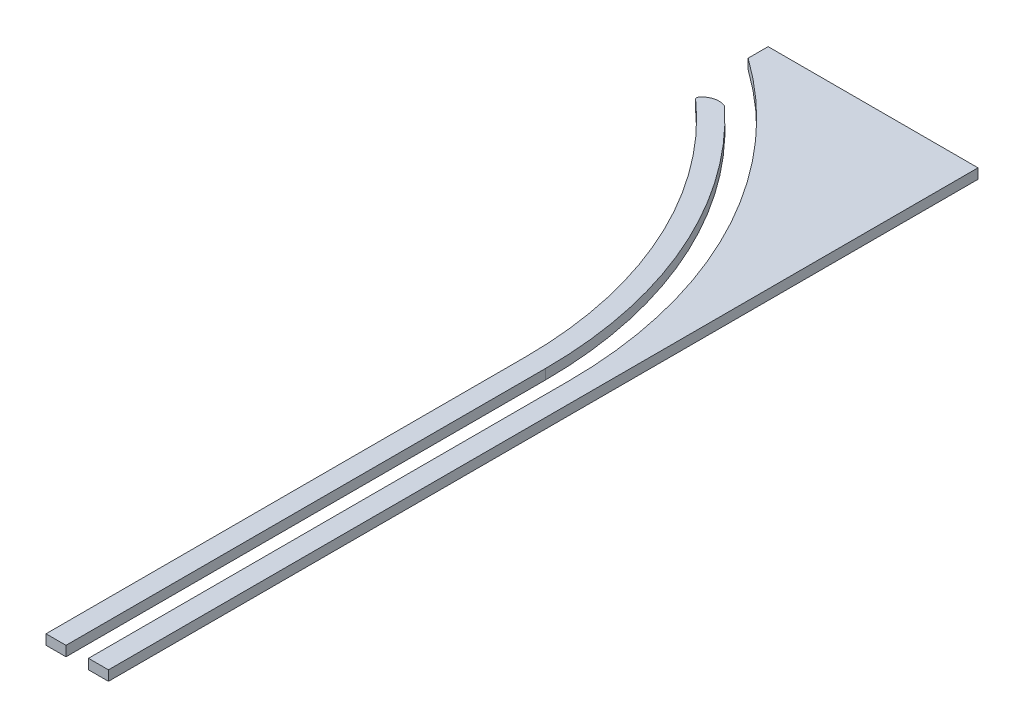
ISO-10303-21;
HEADER;
FILE_DESCRIPTION(('STEP AP214'),'2;1');
FILE_NAME('part.step','',(''),(''),'','','');
FILE_SCHEMA(('AUTOMOTIVE_DESIGN { 1 0 10303 214 1 1 1 1 }'));
ENDSEC;
DATA;
#1=APPLICATION_CONTEXT('core data for automotive mechanical design processes');
#2=APPLICATION_PROTOCOL_DEFINITION('international standard','automotive_design',2000,#1);
#3=PRODUCT_CONTEXT('',#1,'mechanical');
#4=PRODUCT('Part','Part','',(#3));
#5=PRODUCT_RELATED_PRODUCT_CATEGORY('part','',(#4));
#6=PRODUCT_DEFINITION_FORMATION('','',#4);
#7=PRODUCT_DEFINITION_CONTEXT('part definition',#1,'design');
#8=PRODUCT_DEFINITION('design','',#6,#7);
#9=PRODUCT_DEFINITION_SHAPE('','',#8);
#10=(LENGTH_UNIT() NAMED_UNIT(*) SI_UNIT(.MILLI.,.METRE.));
#11=(NAMED_UNIT(*) PLANE_ANGLE_UNIT() SI_UNIT($,.RADIAN.));
#12=(NAMED_UNIT(*) SI_UNIT($,.STERADIAN.) SOLID_ANGLE_UNIT());
#13=UNCERTAINTY_MEASURE_WITH_UNIT(LENGTH_MEASURE(1.E-05),#10,'distance_accuracy_value','');
#14=(GEOMETRIC_REPRESENTATION_CONTEXT(3) GLOBAL_UNCERTAINTY_ASSIGNED_CONTEXT((#13)) GLOBAL_UNIT_ASSIGNED_CONTEXT((#10,
#11,#12)) REPRESENTATION_CONTEXT('',''));
#15=CARTESIAN_POINT('',(0.,0.,0.));
#16=DIRECTION('',(0.,0.,1.));
#17=DIRECTION('',(1.,0.,0.));
#18=AXIS2_PLACEMENT_3D('',#15,#16,#17);
#19=CARTESIAN_POINT('',(255.5875,12.7,0.));
#20=DIRECTION('',(-1.,0.,0.));
#21=DIRECTION('',(0.,0.,1.));
#22=AXIS2_PLACEMENT_3D('',#19,#20,#21);
#23=PLANE('',#22);
#24=DIRECTION('',(0.,0.,-1.));
#25=VECTOR('',#24,1.);
#26=CARTESIAN_POINT('',(255.5875,0.,0.));
#27=LINE('',#26,#25);
#28=CARTESIAN_POINT('',(255.5875,0.,0.));
#29=VERTEX_POINT('',#28);
#30=CARTESIAN_POINT('',(255.5875,0.,-1104.9));
#31=VERTEX_POINT('',#30);
#32=EDGE_CURVE('E138',#29,#31,#27,.T.);
#33=ORIENTED_EDGE('',*,*,#32,.T.);
#34=DIRECTION('',(0.,-1.,0.));
#35=VECTOR('',#34,1.);
#36=CARTESIAN_POINT('',(255.5875,12.7,-1104.9));
#37=LINE('',#36,#35);
#38=CARTESIAN_POINT('',(255.5875,12.7,-1104.9));
#39=VERTEX_POINT('',#38);
#40=EDGE_CURVE('E12',#39,#31,#37,.T.);
#41=ORIENTED_EDGE('',*,*,#40,.F.);
#42=DIRECTION('',(0.,0.,-1.));
#43=VECTOR('',#42,1.);
#44=CARTESIAN_POINT('',(255.5875,12.7,0.));
#45=LINE('',#44,#43);
#46=CARTESIAN_POINT('',(255.5875,12.7,0.));
#47=VERTEX_POINT('',#46);
#48=EDGE_CURVE('E154',#47,#39,#45,.T.);
#49=ORIENTED_EDGE('',*,*,#48,.F.);
#50=DIRECTION('',(0.,-1.,0.));
#51=VECTOR('',#50,1.);
#52=CARTESIAN_POINT('',(255.5875,12.7,0.));
#53=LINE('',#52,#51);
#54=EDGE_CURVE('E134',#47,#29,#53,.T.);
#55=ORIENTED_EDGE('',*,*,#54,.T.);
#56=EDGE_LOOP('',(#33,#41,#49,#55));
#57=FACE_BOUND('',#56,.T.);
#58=ADVANCED_FACE('F49',(#57),#23,.F.);
#59=CARTESIAN_POINT('',(-11.1125,12.7,-1104.9));
#60=DIRECTION('',(0.,0.,1.));
#61=DIRECTION('',(1.,0.,0.));
#62=AXIS2_PLACEMENT_3D('',#59,#60,#61);
#63=PLANE('',#62);
#64=DIRECTION('',(-1.,0.,0.));
#65=VECTOR('',#64,1.);
#66=CARTESIAN_POINT('',(-11.1125,0.,-1104.9));
#67=LINE('',#66,#65);
#68=CARTESIAN_POINT('',(-11.1125,0.,-1104.9));
#69=VERTEX_POINT('',#68);
#70=EDGE_CURVE('E142',#31,#69,#67,.T.);
#71=ORIENTED_EDGE('',*,*,#70,.T.);
#72=DIRECTION('',(0.,-1.,0.));
#73=VECTOR('',#72,1.);
#74=CARTESIAN_POINT('',(-11.1125,12.7,-1104.9));
#75=LINE('',#74,#73);
#76=CARTESIAN_POINT('',(-11.1125,12.7,-1104.9));
#77=VERTEX_POINT('',#76);
#78=EDGE_CURVE('E58',#77,#69,#75,.T.);
#79=ORIENTED_EDGE('',*,*,#78,.F.);
#80=DIRECTION('',(-1.,0.,0.));
#81=VECTOR('',#80,1.);
#82=CARTESIAN_POINT('',(-11.1125,12.7,-1104.9));
#83=LINE('',#82,#81);
#84=EDGE_CURVE('E103',#39,#77,#83,.T.);
#85=ORIENTED_EDGE('',*,*,#84,.F.);
#86=ORIENTED_EDGE('',*,*,#40,.T.);
#87=EDGE_LOOP('',(#71,#79,#85,#86));
#88=FACE_BOUND('',#87,.T.);
#89=ADVANCED_FACE('F182',(#88),#63,.F.);
#90=CARTESIAN_POINT('',(-11.1124999999999,12.7,-1079.5));
#91=DIRECTION('',(1.,0.,0.));
#92=DIRECTION('',(0.,0.,-1.));
#93=AXIS2_PLACEMENT_3D('',#90,#91,#92);
#94=PLANE('',#93);
#95=DIRECTION('',(0.,0.,1.));
#96=VECTOR('',#95,1.);
#97=CARTESIAN_POINT('',(-11.1124999999999,0.,-1079.5));
#98=LINE('',#97,#96);
#99=CARTESIAN_POINT('',(-11.1124999999999,0.,-1079.5));
#100=VERTEX_POINT('',#99);
#101=EDGE_CURVE('E145',#69,#100,#98,.T.);
#102=ORIENTED_EDGE('',*,*,#101,.T.);
#103=DIRECTION('',(0.,-1.,0.));
#104=VECTOR('',#103,1.);
#105=CARTESIAN_POINT('',(-11.1124999999999,12.7,-1079.5));
#106=LINE('',#105,#104);
#107=CARTESIAN_POINT('',(-11.1124999999999,12.7,-1079.5));
#108=VERTEX_POINT('',#107);
#109=EDGE_CURVE('E127',#108,#100,#106,.T.);
#110=ORIENTED_EDGE('',*,*,#109,.F.);
#111=DIRECTION('',(0.,0.,1.));
#112=VECTOR('',#111,1.);
#113=CARTESIAN_POINT('',(-11.1124999999999,12.7,-1079.5));
#114=LINE('',#113,#112);
#115=EDGE_CURVE('E116',#77,#108,#114,.T.);
#116=ORIENTED_EDGE('',*,*,#115,.F.);
#117=ORIENTED_EDGE('',*,*,#78,.T.);
#118=EDGE_LOOP('',(#102,#110,#116,#117));
#119=FACE_BOUND('',#118,.T.);
#120=ADVANCED_FACE('F164',(#119),#94,.F.);
#121=CARTESIAN_POINT('',(-347.996710526316,12.7,-609.6));
#122=DIRECTION('',(0.,-1.,0.));
#123=DIRECTION('',(0.,0.,-1.));
#124=AXIS2_PLACEMENT_3D('',#121,#122,#123);
#125=CYLINDRICAL_SURFACE('',#124,578.184210526316);
#126=CARTESIAN_POINT('',(-347.996710526316,0.,-609.6));
#127=DIRECTION('',(0.,-1.,0.));
#128=DIRECTION('',(0.,0.,-1.));
#129=AXIS2_PLACEMENT_3D('',#126,#127,#128);
#130=CIRCLE('',#129,578.184210526316);
#131=CARTESIAN_POINT('',(230.1875,0.,-609.6));
#132=VERTEX_POINT('',#131);
#133=EDGE_CURVE('E125',#100,#132,#130,.T.);
#134=ORIENTED_EDGE('',*,*,#133,.T.);
#135=DIRECTION('',(0.,-1.,0.));
#136=VECTOR('',#135,1.);
#137=CARTESIAN_POINT('',(230.1875,12.7,-609.6));
#138=LINE('',#137,#136);
#139=CARTESIAN_POINT('',(230.1875,12.7,-609.6));
#140=VERTEX_POINT('',#139);
#141=EDGE_CURVE('E122',#140,#132,#138,.T.);
#142=ORIENTED_EDGE('',*,*,#141,.F.);
#143=CARTESIAN_POINT('',(-347.996710526316,12.7,-609.6));
#144=DIRECTION('',(0.,-1.,0.));
#145=DIRECTION('',(0.,0.,-1.));
#146=AXIS2_PLACEMENT_3D('',#143,#144,#145);
#147=CIRCLE('',#146,578.184210526316);
#148=EDGE_CURVE('E110',#108,#140,#147,.T.);
#149=ORIENTED_EDGE('',*,*,#148,.F.);
#150=ORIENTED_EDGE('',*,*,#109,.T.);
#151=EDGE_LOOP('',(#134,#142,#149,#150));
#152=FACE_BOUND('',#151,.T.);
#153=ADVANCED_FACE('F123',(#152),#125,.F.);
#154=CARTESIAN_POINT('',(230.1875,12.7,0.));
#155=DIRECTION('',(1.,0.,0.));
#156=DIRECTION('',(0.,0.,-1.));
#157=AXIS2_PLACEMENT_3D('',#154,#155,#156);
#158=PLANE('',#157);
#159=DIRECTION('',(0.,0.,1.));
#160=VECTOR('',#159,1.);
#161=CARTESIAN_POINT('',(230.1875,0.,0.));
#162=LINE('',#161,#160);
#163=CARTESIAN_POINT('',(230.1875,0.,0.));
#164=VERTEX_POINT('',#163);
#165=EDGE_CURVE('E89',#132,#164,#162,.T.);
#166=ORIENTED_EDGE('',*,*,#165,.T.);
#167=DIRECTION('',(0.,-1.,0.));
#168=VECTOR('',#167,1.);
#169=CARTESIAN_POINT('',(230.1875,12.7,0.));
#170=LINE('',#169,#168);
#171=CARTESIAN_POINT('',(230.1875,12.7,0.));
#172=VERTEX_POINT('',#171);
#173=EDGE_CURVE('E128',#172,#164,#170,.T.);
#174=ORIENTED_EDGE('',*,*,#173,.F.);
#175=DIRECTION('',(0.,0.,1.));
#176=VECTOR('',#175,1.);
#177=CARTESIAN_POINT('',(230.1875,12.7,0.));
#178=LINE('',#177,#176);
#179=EDGE_CURVE('E114',#140,#172,#178,.T.);
#180=ORIENTED_EDGE('',*,*,#179,.F.);
#181=ORIENTED_EDGE('',*,*,#141,.T.);
#182=EDGE_LOOP('',(#166,#174,#180,#181));
#183=FACE_BOUND('',#182,.T.);
#184=ADVANCED_FACE('F130',(#183),#158,.F.);
#185=CARTESIAN_POINT('',(230.1875,12.7,0.));
#186=DIRECTION('',(0.,0.,-1.));
#187=DIRECTION('',(-1.,0.,0.));
#188=AXIS2_PLACEMENT_3D('',#185,#186,#187);
#189=PLANE('',#188);
#190=DIRECTION('',(1.,0.,0.));
#191=VECTOR('',#190,1.);
#192=CARTESIAN_POINT('',(230.1875,0.,0.));
#193=LINE('',#192,#191);
#194=EDGE_CURVE('E95',#164,#29,#193,.T.);
#195=ORIENTED_EDGE('',*,*,#194,.T.);
#196=ORIENTED_EDGE('',*,*,#54,.F.);
#197=DIRECTION('',(1.,0.,0.));
#198=VECTOR('',#197,1.);
#199=CARTESIAN_POINT('',(230.1875,12.7,0.));
#200=LINE('',#199,#198);
#201=EDGE_CURVE('E66',#172,#47,#200,.T.);
#202=ORIENTED_EDGE('',*,*,#201,.F.);
#203=ORIENTED_EDGE('',*,*,#173,.T.);
#204=EDGE_LOOP('',(#195,#196,#202,#203));
#205=FACE_BOUND('',#204,.T.);
#206=ADVANCED_FACE('F171',(#205),#189,.F.);
#207=CARTESIAN_POINT('',(-347.996710526316,12.7,-609.6));
#208=DIRECTION('',(0.,-1.,0.));
#209=DIRECTION('',(0.,0.,-1.));
#210=AXIS2_PLACEMENT_3D('',#207,#208,#209);
#211=PLANE('',#210);
#212=ORIENTED_EDGE('',*,*,#48,.T.);
#213=ORIENTED_EDGE('',*,*,#84,.T.);
#214=ORIENTED_EDGE('',*,*,#115,.T.);
#215=ORIENTED_EDGE('',*,*,#148,.T.);
#216=ORIENTED_EDGE('',*,*,#179,.T.);
#217=ORIENTED_EDGE('',*,*,#201,.T.);
#218=EDGE_LOOP('',(#212,#213,#214,#215,#216,#217));
#219=FACE_BOUND('',#218,.T.);
#220=ADVANCED_FACE('F112',(#219),#211,.F.);
#221=CARTESIAN_POINT('',(-347.996710526316,0.,-609.6));
#222=DIRECTION('',(0.,-1.,0.));
#223=DIRECTION('',(0.,0.,-1.));
#224=AXIS2_PLACEMENT_3D('',#221,#222,#223);
#225=PLANE('',#224);
#226=ORIENTED_EDGE('',*,*,#32,.F.);
#227=ORIENTED_EDGE('',*,*,#194,.F.);
#228=ORIENTED_EDGE('',*,*,#165,.F.);
#229=ORIENTED_EDGE('',*,*,#133,.F.);
#230=ORIENTED_EDGE('',*,*,#101,.F.);
#231=ORIENTED_EDGE('',*,*,#70,.F.);
#232=EDGE_LOOP('',(#226,#227,#228,#229,#230,#231));
#233=FACE_BOUND('',#232,.T.);
#234=ADVANCED_FACE('F167',(#233),#225,.T.);
#235=CLOSED_SHELL('',(#58,#89,#120,#153,#184,#206,#220,#234));
#236=MANIFOLD_SOLID_BREP('B2',#235);
#237=CARTESIAN_POINT('',(17.5460842992737,12.7,-992.451036276401));
#238=DIRECTION('',(0.,-1.,0.));
#239=DIRECTION('',(0.,0.,-1.));
#240=AXIS2_PLACEMENT_3D('',#237,#238,#239);
#241=CYLINDRICAL_SURFACE('',#240,21.3347076919833);
#242=CARTESIAN_POINT('',(17.5460842992737,0.,-992.451036276401));
#243=DIRECTION('',(0.,1.,0.));
#244=DIRECTION('',(0.,0.,1.));
#245=AXIS2_PLACEMENT_3D('',#242,#243,#244);
#246=CIRCLE('',#245,21.3347076919833);
#247=CARTESIAN_POINT('',(26.6199629643412,0.,-1011.75995852167));
#248=VERTEX_POINT('',#247);
#249=CARTESIAN_POINT('',(0.0177272490470685,0.,-1004.61353813343));
#250=VERTEX_POINT('',#249);
#251=EDGE_CURVE('E333',#248,#250,#246,.T.);
#252=ORIENTED_EDGE('',*,*,#251,.T.);
#253=DIRECTION('',(0.,-1.,0.));
#254=VECTOR('',#253,1.);
#255=CARTESIAN_POINT('',(0.0177272490470685,12.7,-1004.61353813343));
#256=LINE('',#255,#254);
#257=CARTESIAN_POINT('',(0.0177272490470685,12.7,-1004.61353813343));
#258=VERTEX_POINT('',#257);
#259=EDGE_CURVE('E47',#258,#250,#256,.T.);
#260=ORIENTED_EDGE('',*,*,#259,.F.);
#261=CARTESIAN_POINT('',(17.5460842992737,12.7,-992.451036276401));
#262=DIRECTION('',(0.,1.,0.));
#263=DIRECTION('',(0.,0.,1.));
#264=AXIS2_PLACEMENT_3D('',#261,#262,#263);
#265=CIRCLE('',#264,21.3347076919833);
#266=CARTESIAN_POINT('',(26.6199629643412,12.7,-1011.75995852167));
#267=VERTEX_POINT('',#266);
#268=EDGE_CURVE('E345',#267,#258,#265,.T.);
#269=ORIENTED_EDGE('',*,*,#268,.F.);
#270=DIRECTION('',(0.,-1.,0.));
#271=VECTOR('',#270,1.);
#272=CARTESIAN_POINT('',(26.6199629643412,12.7,-1011.75995852167));
#273=LINE('',#272,#271);
#274=EDGE_CURVE('E329',#267,#248,#273,.T.);
#275=ORIENTED_EDGE('',*,*,#274,.T.);
#276=EDGE_LOOP('',(#252,#260,#269,#275));
#277=FACE_BOUND('',#276,.T.);
#278=ADVANCED_FACE('F243',(#277),#241,.T.);
#279=CARTESIAN_POINT('',(2.1045628200029,12.7,-1003.16553354096));
#280=DIRECTION('',(0.,-1.,0.));
#281=DIRECTION('',(0.,0.,-1.));
#282=AXIS2_PLACEMENT_3D('',#279,#280,#281);
#283=CYLINDRICAL_SURFACE('',#282,2.53999999999995);
#284=CARTESIAN_POINT('',(2.1045628200029,0.,-1003.16553354096));
#285=DIRECTION('',(0.,1.,0.));
#286=DIRECTION('',(0.,0.,-1.));
#287=AXIS2_PLACEMENT_3D('',#284,#285,#286);
#288=CIRCLE('',#287,2.53999999999995);
#289=CARTESIAN_POINT('',(0.416364306309591,0.,-1001.26774910158));
#290=VERTEX_POINT('',#289);
#291=EDGE_CURVE('E336',#250,#290,#288,.T.);
#292=ORIENTED_EDGE('',*,*,#291,.T.);
#293=DIRECTION('',(0.,-1.,0.));
#294=VECTOR('',#293,1.);
#295=CARTESIAN_POINT('',(0.416364306309591,12.7,-1001.26774910158));
#296=LINE('',#295,#294);
#297=CARTESIAN_POINT('',(0.416364306309591,12.7,-1001.26774910158));
#298=VERTEX_POINT('',#297);
#299=EDGE_CURVE('E251',#298,#290,#296,.T.);
#300=ORIENTED_EDGE('',*,*,#299,.F.);
#301=CARTESIAN_POINT('',(2.1045628200029,12.7,-1003.16553354096));
#302=DIRECTION('',(0.,1.,0.));
#303=DIRECTION('',(0.,0.,-1.));
#304=AXIS2_PLACEMENT_3D('',#301,#302,#303);
#305=CIRCLE('',#304,2.53999999999995);
#306=EDGE_CURVE('E299',#258,#298,#305,.T.);
#307=ORIENTED_EDGE('',*,*,#306,.F.);
#308=ORIENTED_EDGE('',*,*,#259,.T.);
#309=EDGE_LOOP('',(#292,#300,#307,#308));
#310=FACE_BOUND('',#309,.T.);
#311=ADVANCED_FACE('F370',(#310),#283,.T.);
#312=CARTESIAN_POINT('',(-347.996710526316,12.7,-609.6));
#313=DIRECTION('',(0.,-1.,0.));
#314=DIRECTION('',(0.,0.,-1.));
#315=AXIS2_PLACEMENT_3D('',#312,#313,#314);
#316=CYLINDRICAL_SURFACE('',#315,524.209210526316);
#317=CARTESIAN_POINT('',(-347.996710526316,0.,-609.6));
#318=DIRECTION('',(0.,-1.,0.));
#319=DIRECTION('',(0.,0.,-1.));
#320=AXIS2_PLACEMENT_3D('',#317,#318,#319);
#321=CIRCLE('',#320,524.209210526316);
#322=CARTESIAN_POINT('',(176.2125,0.,-609.6));
#323=VERTEX_POINT('',#322);
#324=EDGE_CURVE('E338',#290,#323,#321,.T.);
#325=ORIENTED_EDGE('',*,*,#324,.T.);
#326=DIRECTION('',(0.,-1.,0.));
#327=VECTOR('',#326,1.);
#328=CARTESIAN_POINT('',(176.2125,12.7,-609.6));
#329=LINE('',#328,#327);
#330=CARTESIAN_POINT('',(176.2125,12.7,-609.6));
#331=VERTEX_POINT('',#330);
#332=EDGE_CURVE('E349',#331,#323,#329,.T.);
#333=ORIENTED_EDGE('',*,*,#332,.F.);
#334=CARTESIAN_POINT('',(-347.996710526316,12.7,-609.6));
#335=DIRECTION('',(0.,-1.,0.));
#336=DIRECTION('',(0.,0.,-1.));
#337=AXIS2_PLACEMENT_3D('',#334,#335,#336);
#338=CIRCLE('',#337,524.209210526316);
#339=EDGE_CURVE('E357',#298,#331,#338,.T.);
#340=ORIENTED_EDGE('',*,*,#339,.F.);
#341=ORIENTED_EDGE('',*,*,#299,.T.);
#342=EDGE_LOOP('',(#325,#333,#340,#341));
#343=FACE_BOUND('',#342,.T.);
#344=ADVANCED_FACE('F355',(#343),#316,.F.);
#345=CARTESIAN_POINT('',(176.2125,12.7,0.));
#346=DIRECTION('',(1.,0.,0.));
#347=DIRECTION('',(0.,0.,-1.));
#348=AXIS2_PLACEMENT_3D('',#345,#346,#347);
#349=PLANE('',#348);
#350=DIRECTION('',(0.,0.,1.));
#351=VECTOR('',#350,1.);
#352=CARTESIAN_POINT('',(176.2125,0.,0.));
#353=LINE('',#352,#351);
#354=CARTESIAN_POINT('',(176.2125,0.,0.));
#355=VERTEX_POINT('',#354);
#356=EDGE_CURVE('E340',#323,#355,#353,.T.);
#357=ORIENTED_EDGE('',*,*,#356,.T.);
#358=DIRECTION('',(0.,-1.,0.));
#359=VECTOR('',#358,1.);
#360=CARTESIAN_POINT('',(176.2125,12.7,0.));
#361=LINE('',#360,#359);
#362=CARTESIAN_POINT('',(176.2125,12.7,0.));
#363=VERTEX_POINT('',#362);
#364=EDGE_CURVE('E324',#363,#355,#361,.T.);
#365=ORIENTED_EDGE('',*,*,#364,.F.);
#366=DIRECTION('',(0.,0.,1.));
#367=VECTOR('',#366,1.);
#368=CARTESIAN_POINT('',(176.2125,12.7,0.));
#369=LINE('',#368,#367);
#370=EDGE_CURVE('E315',#331,#363,#369,.T.);
#371=ORIENTED_EDGE('',*,*,#370,.F.);
#372=ORIENTED_EDGE('',*,*,#332,.T.);
#373=EDGE_LOOP('',(#357,#365,#371,#372));
#374=FACE_BOUND('',#373,.T.);
#375=ADVANCED_FACE('F363',(#374),#349,.F.);
#376=CARTESIAN_POINT('',(176.2125,12.7,0.));
#377=DIRECTION('',(0.,0.,-1.));
#378=DIRECTION('',(-1.,0.,0.));
#379=AXIS2_PLACEMENT_3D('',#376,#377,#378);
#380=PLANE('',#379);
#381=DIRECTION('',(1.,0.,0.));
#382=VECTOR('',#381,1.);
#383=CARTESIAN_POINT('',(176.2125,0.,0.));
#384=LINE('',#383,#382);
#385=CARTESIAN_POINT('',(201.6125,0.,0.));
#386=VERTEX_POINT('',#385);
#387=EDGE_CURVE('E323',#355,#386,#384,.T.);
#388=ORIENTED_EDGE('',*,*,#387,.T.);
#389=DIRECTION('',(0.,-1.,0.));
#390=VECTOR('',#389,1.);
#391=CARTESIAN_POINT('',(201.6125,12.7,0.));
#392=LINE('',#391,#390);
#393=CARTESIAN_POINT('',(201.6125,12.7,0.));
#394=VERTEX_POINT('',#393);
#395=EDGE_CURVE('E320',#394,#386,#392,.T.);
#396=ORIENTED_EDGE('',*,*,#395,.F.);
#397=DIRECTION('',(1.,0.,0.));
#398=VECTOR('',#397,1.);
#399=CARTESIAN_POINT('',(176.2125,12.7,0.));
#400=LINE('',#399,#398);
#401=EDGE_CURVE('E309',#363,#394,#400,.T.);
#402=ORIENTED_EDGE('',*,*,#401,.F.);
#403=ORIENTED_EDGE('',*,*,#364,.T.);
#404=EDGE_LOOP('',(#388,#396,#402,#403));
#405=FACE_BOUND('',#404,.T.);
#406=ADVANCED_FACE('F321',(#405),#380,.F.);
#407=CARTESIAN_POINT('',(201.6125,12.7,0.));
#408=DIRECTION('',(-1.,0.,0.));
#409=DIRECTION('',(0.,0.,1.));
#410=AXIS2_PLACEMENT_3D('',#407,#408,#409);
#411=PLANE('',#410);
#412=DIRECTION('',(0.,0.,-1.));
#413=VECTOR('',#412,1.);
#414=CARTESIAN_POINT('',(201.6125,0.,0.));
#415=LINE('',#414,#413);
#416=CARTESIAN_POINT('',(201.6125,0.,-609.6));
#417=VERTEX_POINT('',#416);
#418=EDGE_CURVE('E285',#386,#417,#415,.T.);
#419=ORIENTED_EDGE('',*,*,#418,.T.);
#420=DIRECTION('',(0.,-1.,0.));
#421=VECTOR('',#420,1.);
#422=CARTESIAN_POINT('',(201.6125,12.7,-609.6));
#423=LINE('',#422,#421);
#424=CARTESIAN_POINT('',(201.6125,12.7,-609.6));
#425=VERTEX_POINT('',#424);
#426=EDGE_CURVE('E325',#425,#417,#423,.T.);
#427=ORIENTED_EDGE('',*,*,#426,.F.);
#428=DIRECTION('',(0.,0.,-1.));
#429=VECTOR('',#428,1.);
#430=CARTESIAN_POINT('',(201.6125,12.7,0.));
#431=LINE('',#430,#429);
#432=EDGE_CURVE('E313',#394,#425,#431,.T.);
#433=ORIENTED_EDGE('',*,*,#432,.F.);
#434=ORIENTED_EDGE('',*,*,#395,.T.);
#435=EDGE_LOOP('',(#419,#427,#433,#434));
#436=FACE_BOUND('',#435,.T.);
#437=ADVANCED_FACE('F327',(#436),#411,.F.);
#438=CARTESIAN_POINT('',(-347.996710526316,12.7,-609.6));
#439=DIRECTION('',(0.,-1.,0.));
#440=DIRECTION('',(0.,0.,-1.));
#441=AXIS2_PLACEMENT_3D('',#438,#439,#440);
#442=CYLINDRICAL_SURFACE('',#441,549.609210526316);
#443=CARTESIAN_POINT('',(-347.996710526316,0.,-609.6));
#444=DIRECTION('',(0.,1.,0.));
#445=DIRECTION('',(0.,0.,-1.));
#446=AXIS2_PLACEMENT_3D('',#443,#444,#445);
#447=CIRCLE('',#446,549.609210526316);
#448=EDGE_CURVE('E291',#417,#248,#447,.T.);
#449=ORIENTED_EDGE('',*,*,#448,.T.);
#450=ORIENTED_EDGE('',*,*,#274,.F.);
#451=CARTESIAN_POINT('',(-347.996710526316,12.7,-609.6));
#452=DIRECTION('',(0.,1.,0.));
#453=DIRECTION('',(0.,0.,-1.));
#454=AXIS2_PLACEMENT_3D('',#451,#452,#453);
#455=CIRCLE('',#454,549.609210526316);
#456=EDGE_CURVE('E259',#425,#267,#455,.T.);
#457=ORIENTED_EDGE('',*,*,#456,.F.);
#458=ORIENTED_EDGE('',*,*,#426,.T.);
#459=EDGE_LOOP('',(#449,#450,#457,#458));
#460=FACE_BOUND('',#459,.T.);
#461=ADVANCED_FACE('F384',(#460),#442,.T.);
#462=CARTESIAN_POINT('',(17.5460842992737,12.7,-992.451036276401));
#463=DIRECTION('',(0.,1.,0.));
#464=DIRECTION('',(0.,0.,1.));
#465=AXIS2_PLACEMENT_3D('',#462,#463,#464);
#466=PLANE('',#465);
#467=ORIENTED_EDGE('',*,*,#268,.T.);
#468=ORIENTED_EDGE('',*,*,#306,.T.);
#469=ORIENTED_EDGE('',*,*,#339,.T.);
#470=ORIENTED_EDGE('',*,*,#370,.T.);
#471=ORIENTED_EDGE('',*,*,#401,.T.);
#472=ORIENTED_EDGE('',*,*,#432,.T.);
#473=ORIENTED_EDGE('',*,*,#456,.T.);
#474=EDGE_LOOP('',(#467,#468,#469,#470,#471,#472,#473));
#475=FACE_BOUND('',#474,.T.);
#476=ADVANCED_FACE('F311',(#475),#466,.T.);
#477=CARTESIAN_POINT('',(17.5460842992737,0.,-992.451036276401));
#478=DIRECTION('',(0.,1.,0.));
#479=DIRECTION('',(0.,0.,1.));
#480=AXIS2_PLACEMENT_3D('',#477,#478,#479);
#481=PLANE('',#480);
#482=ORIENTED_EDGE('',*,*,#251,.F.);
#483=ORIENTED_EDGE('',*,*,#448,.F.);
#484=ORIENTED_EDGE('',*,*,#418,.F.);
#485=ORIENTED_EDGE('',*,*,#387,.F.);
#486=ORIENTED_EDGE('',*,*,#356,.F.);
#487=ORIENTED_EDGE('',*,*,#324,.F.);
#488=ORIENTED_EDGE('',*,*,#291,.F.);
#489=EDGE_LOOP('',(#482,#483,#484,#485,#486,#487,#488));
#490=FACE_BOUND('',#489,.T.);
#491=ADVANCED_FACE('F361',(#490),#481,.F.);
#492=CLOSED_SHELL('',(#278,#311,#344,#375,#406,#437,#461,#476,#491));
#493=MANIFOLD_SOLID_BREP('B6',#492);
#494=ADVANCED_BREP_SHAPE_REPRESENTATION('',(#18,#236,#493),#14);
#495=SHAPE_DEFINITION_REPRESENTATION(#9,#494);
ENDSEC;
END-ISO-10303-21;
